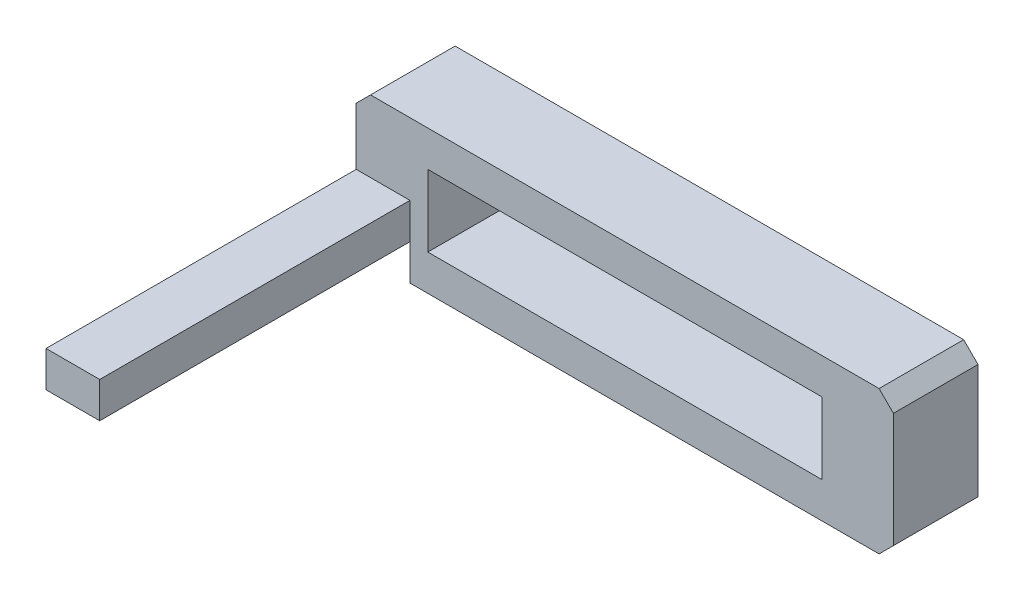
ISO-10303-21;
HEADER;
FILE_DESCRIPTION(('STEP AP214'),'2;1');
FILE_NAME('part.step','',(''),(''),'','','');
FILE_SCHEMA(('AUTOMOTIVE_DESIGN { 1 0 10303 214 1 1 1 1 }'));
ENDSEC;
DATA;
#1=APPLICATION_CONTEXT('core data for automotive mechanical design processes');
#2=APPLICATION_PROTOCOL_DEFINITION('international standard','automotive_design',2000,#1);
#3=PRODUCT_CONTEXT('',#1,'mechanical');
#4=PRODUCT('Part','Part','',(#3));
#5=PRODUCT_RELATED_PRODUCT_CATEGORY('part','',(#4));
#6=PRODUCT_DEFINITION_FORMATION('','',#4);
#7=PRODUCT_DEFINITION_CONTEXT('part definition',#1,'design');
#8=PRODUCT_DEFINITION('design','',#6,#7);
#9=PRODUCT_DEFINITION_SHAPE('','',#8);
#10=(LENGTH_UNIT() NAMED_UNIT(*) SI_UNIT(.MILLI.,.METRE.));
#11=(NAMED_UNIT(*) PLANE_ANGLE_UNIT() SI_UNIT($,.RADIAN.));
#12=(NAMED_UNIT(*) SI_UNIT($,.STERADIAN.) SOLID_ANGLE_UNIT());
#13=UNCERTAINTY_MEASURE_WITH_UNIT(LENGTH_MEASURE(1.E-05),#10,'distance_accuracy_value','');
#14=(GEOMETRIC_REPRESENTATION_CONTEXT(3) GLOBAL_UNCERTAINTY_ASSIGNED_CONTEXT((#13)) GLOBAL_UNIT_ASSIGNED_CONTEXT((#10,
#11,#12)) REPRESENTATION_CONTEXT('',''));
#15=CARTESIAN_POINT('',(0.,0.,0.));
#16=DIRECTION('',(0.,0.,1.));
#17=DIRECTION('',(1.,0.,0.));
#18=AXIS2_PLACEMENT_3D('',#15,#16,#17);
#19=CARTESIAN_POINT('',(-95.25,0.,15.));
#20=DIRECTION('',(-1.,0.,0.));
#21=DIRECTION('',(0.,0.,1.));
#22=AXIS2_PLACEMENT_3D('',#19,#20,#21);
#23=PLANE('',#22);
#24=DIRECTION('',(0.,1.,0.));
#25=VECTOR('',#24,1.);
#26=CARTESIAN_POINT('',(-95.25,0.,0.));
#27=LINE('',#26,#25);
#28=CARTESIAN_POINT('',(-95.25,6.35,0.));
#29=VERTEX_POINT('',#28);
#30=CARTESIAN_POINT('',(-95.25,22.86,0.));
#31=VERTEX_POINT('',#30);
#32=EDGE_CURVE('E230',#29,#31,#27,.T.);
#33=ORIENTED_EDGE('',*,*,#32,.F.);
#34=DIRECTION('',(0.,0.,-1.));
#35=VECTOR('',#34,1.);
#36=CARTESIAN_POINT('',(-95.25,6.35,70.));
#37=LINE('',#36,#35);
#38=CARTESIAN_POINT('',(-95.25,6.35,70.));
#39=VERTEX_POINT('',#38);
#40=EDGE_CURVE('E162',#39,#29,#37,.T.);
#41=ORIENTED_EDGE('',*,*,#40,.F.);
#42=DIRECTION('',(0.,-1.,0.));
#43=VECTOR('',#42,1.);
#44=CARTESIAN_POINT('',(-95.25,6.35,70.));
#45=LINE('',#44,#43);
#46=CARTESIAN_POINT('',(-95.25,12.7,70.));
#47=VERTEX_POINT('',#46);
#48=EDGE_CURVE('E174',#47,#39,#45,.T.);
#49=ORIENTED_EDGE('',*,*,#48,.F.);
#50=DIRECTION('',(0.,0.,-1.));
#51=VECTOR('',#50,1.);
#52=CARTESIAN_POINT('',(-95.25,12.7,70.));
#53=LINE('',#52,#51);
#54=CARTESIAN_POINT('',(-95.25,12.7,15.));
#55=VERTEX_POINT('',#54);
#56=EDGE_CURVE('E184',#47,#55,#53,.T.);
#57=ORIENTED_EDGE('',*,*,#56,.T.);
#58=DIRECTION('',(0.,1.,0.));
#59=VECTOR('',#58,1.);
#60=CARTESIAN_POINT('',(-95.25,0.,15.));
#61=LINE('',#60,#59);
#62=CARTESIAN_POINT('',(-95.25,22.86,15.));
#63=VERTEX_POINT('',#62);
#64=EDGE_CURVE('E210',#55,#63,#61,.T.);
#65=ORIENTED_EDGE('',*,*,#64,.T.);
#66=DIRECTION('',(0.,0.,-1.));
#67=VECTOR('',#66,1.);
#68=CARTESIAN_POINT('',(-95.25,22.86,0.));
#69=LINE('',#68,#67);
#70=EDGE_CURVE('E43',#63,#31,#69,.T.);
#71=ORIENTED_EDGE('',*,*,#70,.T.);
#72=EDGE_LOOP('',(#33,#41,#49,#57,#65,#71));
#73=FACE_BOUND('',#72,.T.);
#74=ADVANCED_FACE('F35',(#73),#23,.T.);
#75=CARTESIAN_POINT('',(0.,0.,15.));
#76=DIRECTION('',(0.,-1.,0.));
#77=DIRECTION('',(0.,0.,-1.));
#78=AXIS2_PLACEMENT_3D('',#75,#76,#77);
#79=PLANE('',#78);
#80=DIRECTION('',(0.,0.,1.));
#81=VECTOR('',#80,1.);
#82=CARTESIAN_POINT('',(-85.725,0.,0.));
#83=LINE('',#82,#81);
#84=CARTESIAN_POINT('',(-85.725,0.,0.));
#85=VERTEX_POINT('',#84);
#86=CARTESIAN_POINT('',(-85.725,0.,15.));
#87=VERTEX_POINT('',#86);
#88=EDGE_CURVE('E156',#85,#87,#83,.T.);
#89=ORIENTED_EDGE('',*,*,#88,.F.);
#90=DIRECTION('',(-1.,0.,0.));
#91=VECTOR('',#90,1.);
#92=CARTESIAN_POINT('',(0.,0.,0.));
#93=LINE('',#92,#91);
#94=CARTESIAN_POINT('',(-2.54000000000001,0.,0.));
#95=VERTEX_POINT('',#94);
#96=EDGE_CURVE('E168',#95,#85,#93,.T.);
#97=ORIENTED_EDGE('',*,*,#96,.F.);
#98=DIRECTION('',(0.,0.,1.));
#99=VECTOR('',#98,1.);
#100=CARTESIAN_POINT('',(-2.54000000000001,0.,15.));
#101=LINE('',#100,#99);
#102=CARTESIAN_POINT('',(-2.54000000000001,0.,15.));
#103=VERTEX_POINT('',#102);
#104=EDGE_CURVE('E11',#95,#103,#101,.T.);
#105=ORIENTED_EDGE('',*,*,#104,.T.);
#106=DIRECTION('',(-1.,0.,0.));
#107=VECTOR('',#106,1.);
#108=CARTESIAN_POINT('',(0.,0.,15.));
#109=LINE('',#108,#107);
#110=EDGE_CURVE('E212',#103,#87,#109,.T.);
#111=ORIENTED_EDGE('',*,*,#110,.T.);
#112=EDGE_LOOP('',(#89,#97,#105,#111));
#113=FACE_BOUND('',#112,.T.);
#114=ADVANCED_FACE('F289',(#113),#79,.T.);
#115=CARTESIAN_POINT('',(0.,0.,15.));
#116=DIRECTION('',(-1.,0.,0.));
#117=DIRECTION('',(0.,0.,1.));
#118=AXIS2_PLACEMENT_3D('',#115,#116,#117);
#119=PLANE('',#118);
#120=DIRECTION('',(0.,1.,0.));
#121=VECTOR('',#120,1.);
#122=CARTESIAN_POINT('',(0.,0.,0.));
#123=LINE('',#122,#121);
#124=CARTESIAN_POINT('',(0.,2.54,0.));
#125=VERTEX_POINT('',#124);
#126=CARTESIAN_POINT('',(0.,22.86,0.));
#127=VERTEX_POINT('',#126);
#128=EDGE_CURVE('E233',#125,#127,#123,.T.);
#129=ORIENTED_EDGE('',*,*,#128,.T.);
#130=DIRECTION('',(0.,0.,1.));
#131=VECTOR('',#130,1.);
#132=CARTESIAN_POINT('',(0.,22.86,15.));
#133=LINE('',#132,#131);
#134=CARTESIAN_POINT('',(0.,22.86,15.));
#135=VERTEX_POINT('',#134);
#136=EDGE_CURVE('E260',#127,#135,#133,.T.);
#137=ORIENTED_EDGE('',*,*,#136,.T.);
#138=DIRECTION('',(0.,1.,0.));
#139=VECTOR('',#138,1.);
#140=CARTESIAN_POINT('',(0.,0.,15.));
#141=LINE('',#140,#139);
#142=CARTESIAN_POINT('',(0.,2.54,15.));
#143=VERTEX_POINT('',#142);
#144=EDGE_CURVE('E214',#143,#135,#141,.T.);
#145=ORIENTED_EDGE('',*,*,#144,.F.);
#146=DIRECTION('',(0.,0.,-1.));
#147=VECTOR('',#146,1.);
#148=CARTESIAN_POINT('',(0.,2.54,0.));
#149=LINE('',#148,#147);
#150=EDGE_CURVE('E257',#143,#125,#149,.T.);
#151=ORIENTED_EDGE('',*,*,#150,.T.);
#152=EDGE_LOOP('',(#129,#137,#145,#151));
#153=FACE_BOUND('',#152,.T.);
#154=ADVANCED_FACE('F284',(#153),#119,.F.);
#155=CARTESIAN_POINT('',(-82.55,0.,15.));
#156=DIRECTION('',(1.,0.,0.));
#157=DIRECTION('',(0.,1.,0.));
#158=AXIS2_PLACEMENT_3D('',#155,#156,#157);
#159=PLANE('',#158);
#160=DIRECTION('',(0.,-1.,0.));
#161=VECTOR('',#160,1.);
#162=CARTESIAN_POINT('',(-82.55,0.,0.));
#163=LINE('',#162,#161);
#164=CARTESIAN_POINT('',(-82.55,19.05,0.));
#165=VERTEX_POINT('',#164);
#166=CARTESIAN_POINT('',(-82.55,6.35,0.));
#167=VERTEX_POINT('',#166);
#168=EDGE_CURVE('E198',#165,#167,#163,.T.);
#169=ORIENTED_EDGE('',*,*,#168,.F.);
#170=DIRECTION('',(0.,0.,-1.));
#171=VECTOR('',#170,1.);
#172=CARTESIAN_POINT('',(-82.55,19.05,15.));
#173=LINE('',#172,#171);
#174=CARTESIAN_POINT('',(-82.55,19.05,15.));
#175=VERTEX_POINT('',#174);
#176=EDGE_CURVE('E244',#175,#165,#173,.T.);
#177=ORIENTED_EDGE('',*,*,#176,.F.);
#178=DIRECTION('',(0.,-1.,0.));
#179=VECTOR('',#178,1.);
#180=CARTESIAN_POINT('',(-82.55,0.,15.));
#181=LINE('',#180,#179);
#182=CARTESIAN_POINT('',(-82.55,6.35,15.));
#183=VERTEX_POINT('',#182);
#184=EDGE_CURVE('E199',#175,#183,#181,.T.);
#185=ORIENTED_EDGE('',*,*,#184,.T.);
#186=DIRECTION('',(0.,0.,-1.));
#187=VECTOR('',#186,1.);
#188=CARTESIAN_POINT('',(-82.55,6.35,15.));
#189=LINE('',#188,#187);
#190=EDGE_CURVE('E219',#183,#167,#189,.T.);
#191=ORIENTED_EDGE('',*,*,#190,.T.);
#192=EDGE_LOOP('',(#169,#177,#185,#191));
#193=FACE_BOUND('',#192,.T.);
#194=ADVANCED_FACE('F330',(#193),#159,.T.);
#195=CARTESIAN_POINT('',(0.,19.05,15.));
#196=DIRECTION('',(0.,-1.,0.));
#197=DIRECTION('',(0.,0.,-1.));
#198=AXIS2_PLACEMENT_3D('',#195,#196,#197);
#199=PLANE('',#198);
#200=DIRECTION('',(-1.,0.,0.));
#201=VECTOR('',#200,1.);
#202=CARTESIAN_POINT('',(0.,19.05,0.));
#203=LINE('',#202,#201);
#204=CARTESIAN_POINT('',(-12.7,19.05,0.));
#205=VERTEX_POINT('',#204);
#206=EDGE_CURVE('E222',#205,#165,#203,.T.);
#207=ORIENTED_EDGE('',*,*,#206,.F.);
#208=DIRECTION('',(0.,0.,-1.));
#209=VECTOR('',#208,1.);
#210=CARTESIAN_POINT('',(-12.7,19.05,15.));
#211=LINE('',#210,#209);
#212=CARTESIAN_POINT('',(-12.7,19.05,15.));
#213=VERTEX_POINT('',#212);
#214=EDGE_CURVE('E242',#213,#205,#211,.T.);
#215=ORIENTED_EDGE('',*,*,#214,.F.);
#216=DIRECTION('',(-1.,0.,0.));
#217=VECTOR('',#216,1.);
#218=CARTESIAN_POINT('',(0.,19.05,15.));
#219=LINE('',#218,#217);
#220=EDGE_CURVE('E202',#213,#175,#219,.T.);
#221=ORIENTED_EDGE('',*,*,#220,.T.);
#222=ORIENTED_EDGE('',*,*,#176,.T.);
#223=EDGE_LOOP('',(#207,#215,#221,#222));
#224=FACE_BOUND('',#223,.T.);
#225=ADVANCED_FACE('F326',(#224),#199,.T.);
#226=CARTESIAN_POINT('',(-12.7,0.,15.));
#227=DIRECTION('',(1.,0.,0.));
#228=DIRECTION('',(0.,1.,0.));
#229=AXIS2_PLACEMENT_3D('',#226,#227,#228);
#230=PLANE('',#229);
#231=DIRECTION('',(0.,-1.,0.));
#232=VECTOR('',#231,1.);
#233=CARTESIAN_POINT('',(-12.7,0.,0.));
#234=LINE('',#233,#232);
#235=CARTESIAN_POINT('',(-12.7,6.35,0.));
#236=VERTEX_POINT('',#235);
#237=EDGE_CURVE('E225',#205,#236,#234,.T.);
#238=ORIENTED_EDGE('',*,*,#237,.T.);
#239=DIRECTION('',(0.,0.,-1.));
#240=VECTOR('',#239,1.);
#241=CARTESIAN_POINT('',(-12.7,6.35,15.));
#242=LINE('',#241,#240);
#243=CARTESIAN_POINT('',(-12.7,6.35,15.));
#244=VERTEX_POINT('',#243);
#245=EDGE_CURVE('E239',#244,#236,#242,.T.);
#246=ORIENTED_EDGE('',*,*,#245,.F.);
#247=DIRECTION('',(0.,-1.,0.));
#248=VECTOR('',#247,1.);
#249=CARTESIAN_POINT('',(-12.7,0.,15.));
#250=LINE('',#249,#248);
#251=EDGE_CURVE('E206',#213,#244,#250,.T.);
#252=ORIENTED_EDGE('',*,*,#251,.F.);
#253=ORIENTED_EDGE('',*,*,#214,.T.);
#254=EDGE_LOOP('',(#238,#246,#252,#253));
#255=FACE_BOUND('',#254,.T.);
#256=ADVANCED_FACE('F322',(#255),#230,.F.);
#257=CARTESIAN_POINT('',(0.,6.35,15.));
#258=DIRECTION('',(0.,-1.,0.));
#259=DIRECTION('',(0.,0.,-1.));
#260=AXIS2_PLACEMENT_3D('',#257,#258,#259);
#261=PLANE('',#260);
#262=DIRECTION('',(-1.,0.,0.));
#263=VECTOR('',#262,1.);
#264=CARTESIAN_POINT('',(0.,6.35,0.));
#265=LINE('',#264,#263);
#266=EDGE_CURVE('E227',#236,#167,#265,.T.);
#267=ORIENTED_EDGE('',*,*,#266,.T.);
#268=ORIENTED_EDGE('',*,*,#190,.F.);
#269=DIRECTION('',(-1.,0.,0.));
#270=VECTOR('',#269,1.);
#271=CARTESIAN_POINT('',(0.,6.35,15.));
#272=LINE('',#271,#270);
#273=EDGE_CURVE('E208',#244,#183,#272,.T.);
#274=ORIENTED_EDGE('',*,*,#273,.F.);
#275=ORIENTED_EDGE('',*,*,#245,.T.);
#276=EDGE_LOOP('',(#267,#268,#274,#275));
#277=FACE_BOUND('',#276,.T.);
#278=ADVANCED_FACE('F319',(#277),#261,.F.);
#279=CARTESIAN_POINT('',(0.,25.4,15.));
#280=DIRECTION('',(0.,-1.,0.));
#281=DIRECTION('',(0.,0.,-1.));
#282=AXIS2_PLACEMENT_3D('',#279,#280,#281);
#283=PLANE('',#282);
#284=DIRECTION('',(-1.,0.,0.));
#285=VECTOR('',#284,1.);
#286=CARTESIAN_POINT('',(0.,25.4,15.));
#287=LINE('',#286,#285);
#288=CARTESIAN_POINT('',(-2.54000000000001,25.4,15.));
#289=VERTEX_POINT('',#288);
#290=CARTESIAN_POINT('',(-92.71,25.4,15.));
#291=VERTEX_POINT('',#290);
#292=EDGE_CURVE('E217',#289,#291,#287,.T.);
#293=ORIENTED_EDGE('',*,*,#292,.F.);
#294=DIRECTION('',(0.,0.,-1.));
#295=VECTOR('',#294,1.);
#296=CARTESIAN_POINT('',(-2.54000000000001,25.4,15.));
#297=LINE('',#296,#295);
#298=CARTESIAN_POINT('',(-2.54000000000001,25.4,0.));
#299=VERTEX_POINT('',#298);
#300=EDGE_CURVE('E248',#289,#299,#297,.T.);
#301=ORIENTED_EDGE('',*,*,#300,.T.);
#302=DIRECTION('',(-1.,0.,0.));
#303=VECTOR('',#302,1.);
#304=CARTESIAN_POINT('',(0.,25.4,0.));
#305=LINE('',#304,#303);
#306=CARTESIAN_POINT('',(-92.71,25.4,0.));
#307=VERTEX_POINT('',#306);
#308=EDGE_CURVE('E203',#299,#307,#305,.T.);
#309=ORIENTED_EDGE('',*,*,#308,.T.);
#310=DIRECTION('',(0.,0.,1.));
#311=VECTOR('',#310,1.);
#312=CARTESIAN_POINT('',(-92.71,25.4,15.));
#313=LINE('',#312,#311);
#314=EDGE_CURVE('E246',#307,#291,#313,.T.);
#315=ORIENTED_EDGE('',*,*,#314,.T.);
#316=EDGE_LOOP('',(#293,#301,#309,#315));
#317=FACE_BOUND('',#316,.T.);
#318=ADVANCED_FACE('F276',(#317),#283,.F.);
#319=CARTESIAN_POINT('',(0.,0.,15.));
#320=DIRECTION('',(0.,0.,1.));
#321=DIRECTION('',(1.,0.,0.));
#322=AXIS2_PLACEMENT_3D('',#319,#320,#321);
#323=PLANE('',#322);
#324=DIRECTION('',(0.,1.,0.));
#325=VECTOR('',#324,1.);
#326=CARTESIAN_POINT('',(-85.725,6.35,15.));
#327=LINE('',#326,#325);
#328=CARTESIAN_POINT('',(-85.725,6.35,15.));
#329=VERTEX_POINT('',#328);
#330=EDGE_CURVE('E152',#87,#329,#327,.T.);
#331=ORIENTED_EDGE('',*,*,#330,.F.);
#332=ORIENTED_EDGE('',*,*,#110,.F.);
#333=DIRECTION('',(0.70710678118655,0.707106781186546,0.));
#334=VECTOR('',#333,1.);
#335=CARTESIAN_POINT('',(-1.27,1.27000000000001,15.));
#336=LINE('',#335,#334);
#337=EDGE_CURVE('E262',#103,#143,#336,.T.);
#338=ORIENTED_EDGE('',*,*,#337,.T.);
#339=ORIENTED_EDGE('',*,*,#144,.T.);
#340=DIRECTION('',(0.707106781186546,-0.707106781186549,0.));
#341=VECTOR('',#340,1.);
#342=CARTESIAN_POINT('',(11.43,11.4299999999999,15.));
#343=LINE('',#342,#341);
#344=EDGE_CURVE('E265',#135,#289,#343,.F.);
#345=ORIENTED_EDGE('',*,*,#344,.T.);
#346=ORIENTED_EDGE('',*,*,#292,.T.);
#347=DIRECTION('',(-0.70710678118655,-0.707106781186546,0.));
#348=VECTOR('',#347,1.);
#349=CARTESIAN_POINT('',(-59.0549999999997,59.0550000000001,15.));
#350=LINE('',#349,#348);
#351=EDGE_CURVE('E50',#291,#63,#350,.T.);
#352=ORIENTED_EDGE('',*,*,#351,.T.);
#353=ORIENTED_EDGE('',*,*,#64,.F.);
#354=DIRECTION('',(-1.,0.,0.));
#355=VECTOR('',#354,1.);
#356=CARTESIAN_POINT('',(-95.25,12.7,15.));
#357=LINE('',#356,#355);
#358=CARTESIAN_POINT('',(-85.725,12.7,15.));
#359=VERTEX_POINT('',#358);
#360=EDGE_CURVE('E178',#359,#55,#357,.T.);
#361=ORIENTED_EDGE('',*,*,#360,.F.);
#362=DIRECTION('',(0.,1.,0.));
#363=VECTOR('',#362,1.);
#364=CARTESIAN_POINT('',(-85.725,6.35,15.));
#365=LINE('',#364,#363);
#366=EDGE_CURVE('E172',#329,#359,#365,.T.);
#367=ORIENTED_EDGE('',*,*,#366,.F.);
#368=EDGE_LOOP('',(#331,#332,#338,#339,#345,#346,#352,#353,#361,#367));
#369=FACE_BOUND('',#368,.T.);
#370=ORIENTED_EDGE('',*,*,#184,.F.);
#371=ORIENTED_EDGE('',*,*,#220,.F.);
#372=ORIENTED_EDGE('',*,*,#251,.T.);
#373=ORIENTED_EDGE('',*,*,#273,.T.);
#374=EDGE_LOOP('',(#370,#371,#372,#373));
#375=FACE_BOUND('',#374,.T.);
#376=ADVANCED_FACE('F290',(#369,#375),#323,.T.);
#377=CARTESIAN_POINT('',(0.,0.,0.));
#378=DIRECTION('',(0.,0.,1.));
#379=DIRECTION('',(1.,0.,0.));
#380=AXIS2_PLACEMENT_3D('',#377,#378,#379);
#381=PLANE('',#380);
#382=ORIENTED_EDGE('',*,*,#168,.T.);
#383=ORIENTED_EDGE('',*,*,#266,.F.);
#384=ORIENTED_EDGE('',*,*,#237,.F.);
#385=ORIENTED_EDGE('',*,*,#206,.T.);
#386=EDGE_LOOP('',(#382,#383,#384,#385));
#387=FACE_BOUND('',#386,.T.);
#388=ORIENTED_EDGE('',*,*,#96,.T.);
#389=DIRECTION('',(0.,1.,0.));
#390=VECTOR('',#389,1.);
#391=CARTESIAN_POINT('',(-85.725,6.35,0.));
#392=LINE('',#391,#390);
#393=CARTESIAN_POINT('',(-85.725,6.35,0.));
#394=VERTEX_POINT('',#393);
#395=EDGE_CURVE('E149',#85,#394,#392,.T.);
#396=ORIENTED_EDGE('',*,*,#395,.T.);
#397=DIRECTION('',(-1.,0.,0.));
#398=VECTOR('',#397,1.);
#399=CARTESIAN_POINT('',(-85.725,6.35,0.));
#400=LINE('',#399,#398);
#401=EDGE_CURVE('E157',#394,#29,#400,.T.);
#402=ORIENTED_EDGE('',*,*,#401,.T.);
#403=ORIENTED_EDGE('',*,*,#32,.T.);
#404=DIRECTION('',(0.70710678118655,0.707106781186546,0.));
#405=VECTOR('',#404,1.);
#406=CARTESIAN_POINT('',(-95.25,22.86,0.));
#407=LINE('',#406,#405);
#408=EDGE_CURVE('E253',#31,#307,#407,.T.);
#409=ORIENTED_EDGE('',*,*,#408,.T.);
#410=ORIENTED_EDGE('',*,*,#308,.F.);
#411=DIRECTION('',(-0.707106781186546,0.707106781186549,0.));
#412=VECTOR('',#411,1.);
#413=CARTESIAN_POINT('',(-2.54000000000001,25.4,0.));
#414=LINE('',#413,#412);
#415=EDGE_CURVE('E255',#299,#127,#414,.F.);
#416=ORIENTED_EDGE('',*,*,#415,.T.);
#417=ORIENTED_EDGE('',*,*,#128,.F.);
#418=DIRECTION('',(-0.70710678118655,-0.707106781186546,0.));
#419=VECTOR('',#418,1.);
#420=CARTESIAN_POINT('',(0.,2.54,0.));
#421=LINE('',#420,#419);
#422=EDGE_CURVE('E251',#125,#95,#421,.T.);
#423=ORIENTED_EDGE('',*,*,#422,.T.);
#424=EDGE_LOOP('',(#388,#396,#402,#403,#409,#410,#416,#417,#423));
#425=FACE_BOUND('',#424,.T.);
#426=ADVANCED_FACE('F167',(#387,#425),#381,.F.);
#427=CARTESIAN_POINT('',(-95.25,6.35,70.));
#428=DIRECTION('',(0.,1.,0.));
#429=DIRECTION('',(0.,0.,1.));
#430=AXIS2_PLACEMENT_3D('',#427,#428,#429);
#431=PLANE('',#430);
#432=ORIENTED_EDGE('',*,*,#40,.T.);
#433=ORIENTED_EDGE('',*,*,#401,.F.);
#434=DIRECTION('',(0.,0.,1.));
#435=VECTOR('',#434,1.);
#436=CARTESIAN_POINT('',(-85.725,6.35,0.));
#437=LINE('',#436,#435);
#438=EDGE_CURVE('E145',#394,#329,#437,.T.);
#439=ORIENTED_EDGE('',*,*,#438,.T.);
#440=DIRECTION('',(0.,0.,-1.));
#441=VECTOR('',#440,1.);
#442=CARTESIAN_POINT('',(-85.725,6.35,70.));
#443=LINE('',#442,#441);
#444=CARTESIAN_POINT('',(-85.725,6.35,70.));
#445=VERTEX_POINT('',#444);
#446=EDGE_CURVE('E194',#445,#329,#443,.T.);
#447=ORIENTED_EDGE('',*,*,#446,.F.);
#448=DIRECTION('',(1.,0.,0.));
#449=VECTOR('',#448,1.);
#450=CARTESIAN_POINT('',(-95.25,6.35,70.));
#451=LINE('',#450,#449);
#452=EDGE_CURVE('E177',#39,#445,#451,.T.);
#453=ORIENTED_EDGE('',*,*,#452,.F.);
#454=EDGE_LOOP('',(#432,#433,#439,#447,#453));
#455=FACE_BOUND('',#454,.T.);
#456=ADVANCED_FACE('F160',(#455),#431,.F.);
#457=CARTESIAN_POINT('',(-85.725,6.35,70.));
#458=DIRECTION('',(-1.,0.,0.));
#459=DIRECTION('',(0.,0.,1.));
#460=AXIS2_PLACEMENT_3D('',#457,#458,#459);
#461=PLANE('',#460);
#462=ORIENTED_EDGE('',*,*,#366,.T.);
#463=DIRECTION('',(0.,0.,-1.));
#464=VECTOR('',#463,1.);
#465=CARTESIAN_POINT('',(-85.725,12.7,70.));
#466=LINE('',#465,#464);
#467=CARTESIAN_POINT('',(-85.725,12.7,70.));
#468=VERTEX_POINT('',#467);
#469=EDGE_CURVE('E191',#468,#359,#466,.T.);
#470=ORIENTED_EDGE('',*,*,#469,.F.);
#471=DIRECTION('',(0.,1.,0.));
#472=VECTOR('',#471,1.);
#473=CARTESIAN_POINT('',(-85.725,6.35,70.));
#474=LINE('',#473,#472);
#475=EDGE_CURVE('E180',#445,#468,#474,.T.);
#476=ORIENTED_EDGE('',*,*,#475,.F.);
#477=ORIENTED_EDGE('',*,*,#446,.T.);
#478=EDGE_LOOP('',(#462,#470,#476,#477));
#479=FACE_BOUND('',#478,.T.);
#480=ADVANCED_FACE('F295',(#479),#461,.F.);
#481=CARTESIAN_POINT('',(-95.25,12.7,70.));
#482=DIRECTION('',(0.,-1.,0.));
#483=DIRECTION('',(0.,0.,-1.));
#484=AXIS2_PLACEMENT_3D('',#481,#482,#483);
#485=PLANE('',#484);
#486=ORIENTED_EDGE('',*,*,#360,.T.);
#487=ORIENTED_EDGE('',*,*,#56,.F.);
#488=DIRECTION('',(-1.,0.,0.));
#489=VECTOR('',#488,1.);
#490=CARTESIAN_POINT('',(-95.25,12.7,70.));
#491=LINE('',#490,#489);
#492=EDGE_CURVE('E182',#468,#47,#491,.T.);
#493=ORIENTED_EDGE('',*,*,#492,.F.);
#494=ORIENTED_EDGE('',*,*,#469,.T.);
#495=EDGE_LOOP('',(#486,#487,#493,#494));
#496=FACE_BOUND('',#495,.T.);
#497=ADVANCED_FACE('F302',(#496),#485,.F.);
#498=CARTESIAN_POINT('',(0.,0.,70.));
#499=DIRECTION('',(0.,0.,-1.));
#500=DIRECTION('',(-1.,0.,0.));
#501=AXIS2_PLACEMENT_3D('',#498,#499,#500);
#502=PLANE('',#501);
#503=ORIENTED_EDGE('',*,*,#48,.T.);
#504=ORIENTED_EDGE('',*,*,#452,.T.);
#505=ORIENTED_EDGE('',*,*,#475,.T.);
#506=ORIENTED_EDGE('',*,*,#492,.T.);
#507=EDGE_LOOP('',(#503,#504,#505,#506));
#508=FACE_BOUND('',#507,.T.);
#509=ADVANCED_FACE('F298',(#508),#502,.F.);
#510=CARTESIAN_POINT('',(-2.54000000000001,25.4,15.));
#511=DIRECTION('',(-0.707106781186549,-0.707106781186545,0.));
#512=DIRECTION('',(0.,0.,-1.));
#513=AXIS2_PLACEMENT_3D('',#510,#511,#512);
#514=PLANE('',#513);
#515=ORIENTED_EDGE('',*,*,#344,.F.);
#516=ORIENTED_EDGE('',*,*,#136,.F.);
#517=ORIENTED_EDGE('',*,*,#415,.F.);
#518=ORIENTED_EDGE('',*,*,#300,.F.);
#519=EDGE_LOOP('',(#515,#516,#517,#518));
#520=FACE_BOUND('',#519,.T.);
#521=ADVANCED_FACE('F280',(#520),#514,.F.);
#522=CARTESIAN_POINT('',(-95.25,22.86,15.));
#523=DIRECTION('',(-0.707106781186546,0.70710678118655,0.));
#524=DIRECTION('',(0.,0.,1.));
#525=AXIS2_PLACEMENT_3D('',#522,#523,#524);
#526=PLANE('',#525);
#527=ORIENTED_EDGE('',*,*,#351,.F.);
#528=ORIENTED_EDGE('',*,*,#314,.F.);
#529=ORIENTED_EDGE('',*,*,#408,.F.);
#530=ORIENTED_EDGE('',*,*,#70,.F.);
#531=EDGE_LOOP('',(#527,#528,#529,#530));
#532=FACE_BOUND('',#531,.T.);
#533=ADVANCED_FACE('F271',(#532),#526,.T.);
#534=CARTESIAN_POINT('',(0.,2.54,15.));
#535=DIRECTION('',(0.707106781186546,-0.70710678118655,0.));
#536=DIRECTION('',(0.,0.,1.));
#537=AXIS2_PLACEMENT_3D('',#534,#535,#536);
#538=PLANE('',#537);
#539=ORIENTED_EDGE('',*,*,#337,.F.);
#540=ORIENTED_EDGE('',*,*,#104,.F.);
#541=ORIENTED_EDGE('',*,*,#422,.F.);
#542=ORIENTED_EDGE('',*,*,#150,.F.);
#543=EDGE_LOOP('',(#539,#540,#541,#542));
#544=FACE_BOUND('',#543,.T.);
#545=ADVANCED_FACE('F37',(#544),#538,.T.);
#546=CARTESIAN_POINT('',(-85.725,6.35,0.));
#547=DIRECTION('',(1.,0.,0.));
#548=DIRECTION('',(0.,0.,-1.));
#549=AXIS2_PLACEMENT_3D('',#546,#547,#548);
#550=PLANE('',#549);
#551=ORIENTED_EDGE('',*,*,#330,.T.);
#552=ORIENTED_EDGE('',*,*,#438,.F.);
#553=ORIENTED_EDGE('',*,*,#395,.F.);
#554=ORIENTED_EDGE('',*,*,#88,.T.);
#555=EDGE_LOOP('',(#551,#552,#553,#554));
#556=FACE_BOUND('',#555,.T.);
#557=ADVANCED_FACE('F147',(#556),#550,.F.);
#558=CLOSED_SHELL('',(#74,#114,#154,#194,#225,#256,#278,#318,#376,#426,#456,#480,#497,#509,#521,
#533,#545,#557));
#559=MANIFOLD_SOLID_BREP('B2',#558);
#560=ADVANCED_BREP_SHAPE_REPRESENTATION('',(#18,#559),#14);
#561=SHAPE_DEFINITION_REPRESENTATION(#9,#560);
ENDSEC;
END-ISO-10303-21;
